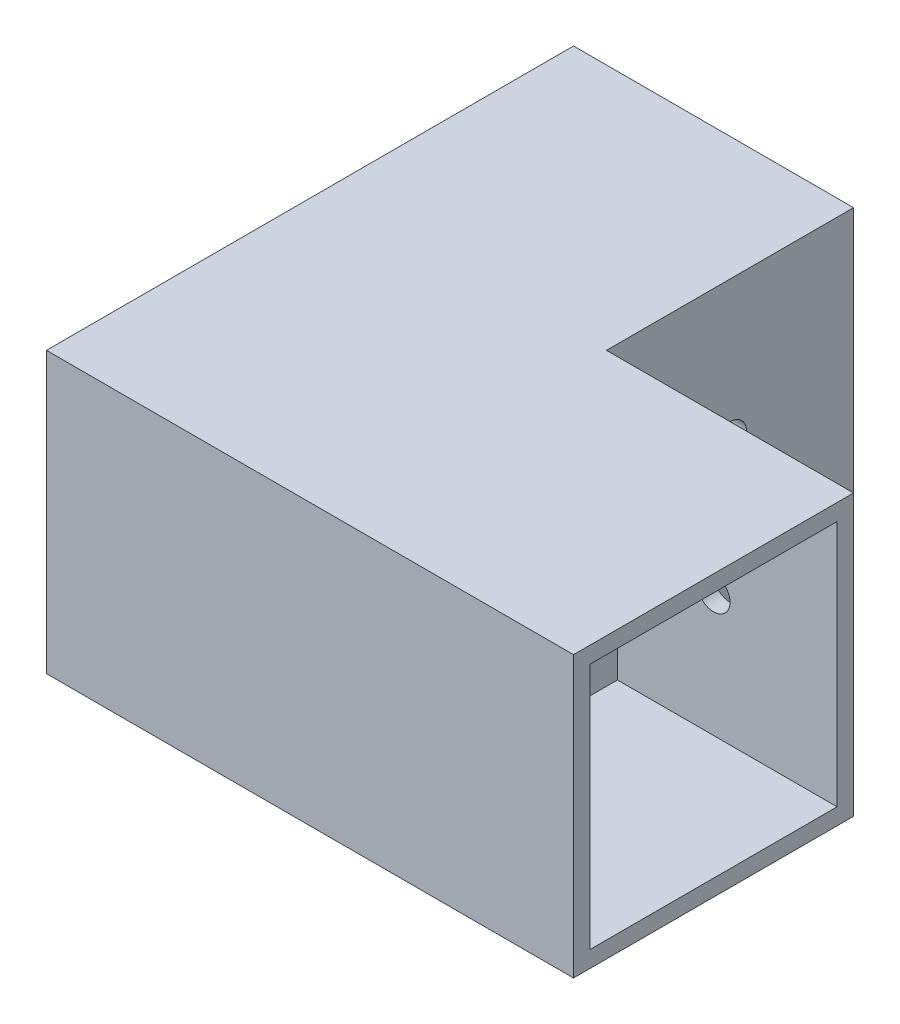
ISO-10303-21;
HEADER;
FILE_DESCRIPTION(('STEP AP214'),'2;1');
FILE_NAME('part.step','',(''),(''),'','','');
FILE_SCHEMA(('AUTOMOTIVE_DESIGN { 1 0 10303 214 1 1 1 1 }'));
ENDSEC;
DATA;
#1=APPLICATION_CONTEXT('core data for automotive mechanical design processes');
#2=APPLICATION_PROTOCOL_DEFINITION('international standard','automotive_design',2000,#1);
#3=PRODUCT_CONTEXT('',#1,'mechanical');
#4=PRODUCT('Part','Part','',(#3));
#5=PRODUCT_RELATED_PRODUCT_CATEGORY('part','',(#4));
#6=PRODUCT_DEFINITION_FORMATION('','',#4);
#7=PRODUCT_DEFINITION_CONTEXT('part definition',#1,'design');
#8=PRODUCT_DEFINITION('design','',#6,#7);
#9=PRODUCT_DEFINITION_SHAPE('','',#8);
#10=(LENGTH_UNIT() NAMED_UNIT(*) SI_UNIT(.MILLI.,.METRE.));
#11=(NAMED_UNIT(*) PLANE_ANGLE_UNIT() SI_UNIT($,.RADIAN.));
#12=(NAMED_UNIT(*) SI_UNIT($,.STERADIAN.) SOLID_ANGLE_UNIT());
#13=UNCERTAINTY_MEASURE_WITH_UNIT(LENGTH_MEASURE(1.E-05),#10,'distance_accuracy_value','');
#14=(GEOMETRIC_REPRESENTATION_CONTEXT(3) GLOBAL_UNCERTAINTY_ASSIGNED_CONTEXT((#13)) GLOBAL_UNIT_ASSIGNED_CONTEXT((#10,
#11,#12)) REPRESENTATION_CONTEXT('',''));
#15=CARTESIAN_POINT('',(0.,0.,0.));
#16=DIRECTION('',(0.,0.,1.));
#17=DIRECTION('',(1.,0.,0.));
#18=AXIS2_PLACEMENT_3D('',#15,#16,#17);
#19=CARTESIAN_POINT('',(93.,51.,3.));
#20=DIRECTION('',(0.,0.,-1.));
#21=DIRECTION('',(-1.,0.,0.));
#22=AXIS2_PLACEMENT_3D('',#19,#20,#21);
#23=PLANE('',#22);
#24=DIRECTION('',(1.,0.,0.));
#25=VECTOR('',#24,1.);
#26=CARTESIAN_POINT('',(93.,0.,3.));
#27=LINE('',#26,#25);
#28=CARTESIAN_POINT('',(-3.,0.,3.));
#29=VERTEX_POINT('',#28);
#30=CARTESIAN_POINT('',(93.,0.,3.));
#31=VERTEX_POINT('',#30);
#32=EDGE_CURVE('E199',#29,#31,#27,.T.);
#33=ORIENTED_EDGE('',*,*,#32,.T.);
#34=DIRECTION('',(0.,-1.,0.));
#35=VECTOR('',#34,1.);
#36=CARTESIAN_POINT('',(93.,51.,3.));
#37=LINE('',#36,#35);
#38=CARTESIAN_POINT('',(93.,51.,3.));
#39=VERTEX_POINT('',#38);
#40=EDGE_CURVE('E11',#39,#31,#37,.T.);
#41=ORIENTED_EDGE('',*,*,#40,.F.);
#42=DIRECTION('',(1.,0.,0.));
#43=VECTOR('',#42,1.);
#44=CARTESIAN_POINT('',(93.,51.,3.));
#45=LINE('',#44,#43);
#46=CARTESIAN_POINT('',(-3.,51.,3.));
#47=VERTEX_POINT('',#46);
#48=EDGE_CURVE('E205',#47,#39,#45,.T.);
#49=ORIENTED_EDGE('',*,*,#48,.F.);
#50=DIRECTION('',(0.,-1.,0.));
#51=VECTOR('',#50,1.);
#52=CARTESIAN_POINT('',(-3.,51.,3.));
#53=LINE('',#52,#51);
#54=EDGE_CURVE('E219',#47,#29,#53,.T.);
#55=ORIENTED_EDGE('',*,*,#54,.T.);
#56=EDGE_LOOP('',(#33,#41,#49,#55));
#57=FACE_BOUND('',#56,.T.);
#58=ADVANCED_FACE('F33',(#57),#23,.F.);
#59=CARTESIAN_POINT('',(93.,51.,-48.));
#60=DIRECTION('',(-1.,0.,0.));
#61=DIRECTION('',(0.,0.,1.));
#62=AXIS2_PLACEMENT_3D('',#59,#60,#61);
#63=PLANE('',#62);
#64=DIRECTION('',(0.,1.,0.));
#65=VECTOR('',#64,1.);
#66=CARTESIAN_POINT('',(93.,3.,-45.));
#67=LINE('',#66,#65);
#68=CARTESIAN_POINT('',(93.,3.,-45.));
#69=VERTEX_POINT('',#68);
#70=CARTESIAN_POINT('',(93.,48.,-45.));
#71=VERTEX_POINT('',#70);
#72=EDGE_CURVE('E189',#69,#71,#67,.T.);
#73=ORIENTED_EDGE('',*,*,#72,.F.);
#74=DIRECTION('',(0.,0.,-1.));
#75=VECTOR('',#74,1.);
#76=CARTESIAN_POINT('',(93.,3.,0.));
#77=LINE('',#76,#75);
#78=CARTESIAN_POINT('',(93.,3.,0.));
#79=VERTEX_POINT('',#78);
#80=EDGE_CURVE('E55',#79,#69,#77,.T.);
#81=ORIENTED_EDGE('',*,*,#80,.F.);
#82=DIRECTION('',(0.,-1.,0.));
#83=VECTOR('',#82,1.);
#84=CARTESIAN_POINT('',(93.,48.,0.));
#85=LINE('',#84,#83);
#86=CARTESIAN_POINT('',(93.,48.,0.));
#87=VERTEX_POINT('',#86);
#88=EDGE_CURVE('E178',#87,#79,#85,.T.);
#89=ORIENTED_EDGE('',*,*,#88,.F.);
#90=DIRECTION('',(0.,0.,1.));
#91=VECTOR('',#90,1.);
#92=CARTESIAN_POINT('',(93.,48.,-45.));
#93=LINE('',#92,#91);
#94=EDGE_CURVE('E192',#71,#87,#93,.T.);
#95=ORIENTED_EDGE('',*,*,#94,.F.);
#96=EDGE_LOOP('',(#73,#81,#89,#95));
#97=FACE_BOUND('',#96,.T.);
#98=DIRECTION('',(0.,0.,-1.));
#99=VECTOR('',#98,1.);
#100=CARTESIAN_POINT('',(93.,0.,-48.));
#101=LINE('',#100,#99);
#102=CARTESIAN_POINT('',(93.,0.,-48.));
#103=VERTEX_POINT('',#102);
#104=EDGE_CURVE('E222',#31,#103,#101,.T.);
#105=ORIENTED_EDGE('',*,*,#104,.T.);
#106=DIRECTION('',(0.,-1.,0.));
#107=VECTOR('',#106,1.);
#108=CARTESIAN_POINT('',(93.,51.,-48.));
#109=LINE('',#108,#107);
#110=CARTESIAN_POINT('',(93.,51.,-48.));
#111=VERTEX_POINT('',#110);
#112=EDGE_CURVE('E40',#111,#103,#109,.T.);
#113=ORIENTED_EDGE('',*,*,#112,.F.);
#114=DIRECTION('',(0.,0.,-1.));
#115=VECTOR('',#114,1.);
#116=CARTESIAN_POINT('',(93.,51.,-48.));
#117=LINE('',#116,#115);
#118=EDGE_CURVE('E208',#39,#111,#117,.T.);
#119=ORIENTED_EDGE('',*,*,#118,.F.);
#120=ORIENTED_EDGE('',*,*,#40,.T.);
#121=EDGE_LOOP('',(#105,#113,#119,#120));
#122=FACE_BOUND('',#121,.T.);
#123=ADVANCED_FACE('F269',(#97,#122),#63,.F.);
#124=CARTESIAN_POINT('',(48.,51.,-48.));
#125=DIRECTION('',(0.,0.,1.));
#126=DIRECTION('',(1.,0.,0.));
#127=AXIS2_PLACEMENT_3D('',#124,#125,#126);
#128=PLANE('',#127);
#129=CARTESIAN_POINT('',(70.5,25.5,-48.));
#130=DIRECTION('',(0.,0.,-1.));
#131=DIRECTION('',(-1.,0.,0.));
#132=AXIS2_PLACEMENT_3D('',#129,#130,#131);
#133=CIRCLE('',#132,3.00000000000001);
#134=CARTESIAN_POINT('',(67.5,25.5,-48.));
#135=VERTEX_POINT('',#134);
#136=EDGE_CURVE('E159',#135,#135,#133,.T.);
#137=ORIENTED_EDGE('',*,*,#136,.F.);
#138=EDGE_LOOP('',(#137));
#139=FACE_BOUND('',#138,.T.);
#140=DIRECTION('',(-1.,0.,0.));
#141=VECTOR('',#140,1.);
#142=CARTESIAN_POINT('',(48.,0.,-48.));
#143=LINE('',#142,#141);
#144=CARTESIAN_POINT('',(48.,0.,-48.));
#145=VERTEX_POINT('',#144);
#146=EDGE_CURVE('E224',#103,#145,#143,.T.);
#147=ORIENTED_EDGE('',*,*,#146,.T.);
#148=DIRECTION('',(0.,-1.,0.));
#149=VECTOR('',#148,1.);
#150=CARTESIAN_POINT('',(48.,51.,-48.));
#151=LINE('',#150,#149);
#152=CARTESIAN_POINT('',(48.,51.,-48.));
#153=VERTEX_POINT('',#152);
#154=EDGE_CURVE('E239',#153,#145,#151,.T.);
#155=ORIENTED_EDGE('',*,*,#154,.F.);
#156=DIRECTION('',(-1.,0.,0.));
#157=VECTOR('',#156,1.);
#158=CARTESIAN_POINT('',(48.,51.,-48.));
#159=LINE('',#158,#157);
#160=EDGE_CURVE('E211',#111,#153,#159,.T.);
#161=ORIENTED_EDGE('',*,*,#160,.F.);
#162=ORIENTED_EDGE('',*,*,#112,.T.);
#163=EDGE_LOOP('',(#147,#155,#161,#162));
#164=FACE_BOUND('',#163,.T.);
#165=ADVANCED_FACE('F246',(#139,#164),#128,.F.);
#166=CARTESIAN_POINT('',(48.,51.,-93.));
#167=DIRECTION('',(-1.,0.,0.));
#168=DIRECTION('',(0.,0.,1.));
#169=AXIS2_PLACEMENT_3D('',#166,#167,#168);
#170=PLANE('',#169);
#171=CARTESIAN_POINT('',(48.,25.5,-70.5));
#172=DIRECTION('',(1.,0.,0.));
#173=DIRECTION('',(0.,0.,-1.));
#174=AXIS2_PLACEMENT_3D('',#171,#172,#173);
#175=CIRCLE('',#174,3.00000000000001);
#176=CARTESIAN_POINT('',(48.,25.5,-73.5));
#177=VERTEX_POINT('',#176);
#178=EDGE_CURVE('E301',#177,#177,#175,.T.);
#179=ORIENTED_EDGE('',*,*,#178,.F.);
#180=EDGE_LOOP('',(#179));
#181=FACE_BOUND('',#180,.T.);
#182=DIRECTION('',(0.,0.,-1.));
#183=VECTOR('',#182,1.);
#184=CARTESIAN_POINT('',(48.,0.,-93.));
#185=LINE('',#184,#183);
#186=CARTESIAN_POINT('',(48.,0.,-93.));
#187=VERTEX_POINT('',#186);
#188=EDGE_CURVE('E226',#145,#187,#185,.T.);
#189=ORIENTED_EDGE('',*,*,#188,.T.);
#190=DIRECTION('',(0.,-1.,0.));
#191=VECTOR('',#190,1.);
#192=CARTESIAN_POINT('',(48.,51.,-93.));
#193=LINE('',#192,#191);
#194=CARTESIAN_POINT('',(48.,51.,-93.));
#195=VERTEX_POINT('',#194);
#196=EDGE_CURVE('E236',#195,#187,#193,.T.);
#197=ORIENTED_EDGE('',*,*,#196,.F.);
#198=DIRECTION('',(0.,0.,-1.));
#199=VECTOR('',#198,1.);
#200=CARTESIAN_POINT('',(48.,51.,-93.));
#201=LINE('',#200,#199);
#202=EDGE_CURVE('E213',#153,#195,#201,.T.);
#203=ORIENTED_EDGE('',*,*,#202,.F.);
#204=ORIENTED_EDGE('',*,*,#154,.T.);
#205=EDGE_LOOP('',(#189,#197,#203,#204));
#206=FACE_BOUND('',#205,.T.);
#207=ADVANCED_FACE('F257',(#181,#206),#170,.F.);
#208=CARTESIAN_POINT('',(-3.,51.,-93.));
#209=DIRECTION('',(0.,0.,1.));
#210=DIRECTION('',(1.,0.,0.));
#211=AXIS2_PLACEMENT_3D('',#208,#209,#210);
#212=PLANE('',#211);
#213=DIRECTION('',(0.,1.,0.));
#214=VECTOR('',#213,1.);
#215=CARTESIAN_POINT('',(0.,3.,-93.));
#216=LINE('',#215,#214);
#217=CARTESIAN_POINT('',(0.,3.,-93.));
#218=VERTEX_POINT('',#217);
#219=CARTESIAN_POINT('',(0.,48.,-93.));
#220=VERTEX_POINT('',#219);
#221=EDGE_CURVE('E165',#218,#220,#216,.T.);
#222=ORIENTED_EDGE('',*,*,#221,.F.);
#223=DIRECTION('',(-1.,0.,0.));
#224=VECTOR('',#223,1.);
#225=CARTESIAN_POINT('',(45.,3.,-93.));
#226=LINE('',#225,#224);
#227=CARTESIAN_POINT('',(45.,3.,-93.));
#228=VERTEX_POINT('',#227);
#229=EDGE_CURVE('E47',#228,#218,#226,.T.);
#230=ORIENTED_EDGE('',*,*,#229,.F.);
#231=DIRECTION('',(0.,-1.,0.));
#232=VECTOR('',#231,1.);
#233=CARTESIAN_POINT('',(45.,48.,-93.));
#234=LINE('',#233,#232);
#235=CARTESIAN_POINT('',(45.,48.,-93.));
#236=VERTEX_POINT('',#235);
#237=EDGE_CURVE('E153',#236,#228,#234,.T.);
#238=ORIENTED_EDGE('',*,*,#237,.F.);
#239=DIRECTION('',(1.,0.,0.));
#240=VECTOR('',#239,1.);
#241=CARTESIAN_POINT('',(0.,48.,-93.));
#242=LINE('',#241,#240);
#243=EDGE_CURVE('E156',#220,#236,#242,.T.);
#244=ORIENTED_EDGE('',*,*,#243,.F.);
#245=EDGE_LOOP('',(#222,#230,#238,#244));
#246=FACE_BOUND('',#245,.T.);
#247=DIRECTION('',(-1.,0.,0.));
#248=VECTOR('',#247,1.);
#249=CARTESIAN_POINT('',(-3.,0.,-93.));
#250=LINE('',#249,#248);
#251=CARTESIAN_POINT('',(-3.,0.,-93.));
#252=VERTEX_POINT('',#251);
#253=EDGE_CURVE('E228',#187,#252,#250,.T.);
#254=ORIENTED_EDGE('',*,*,#253,.T.);
#255=DIRECTION('',(0.,-1.,0.));
#256=VECTOR('',#255,1.);
#257=CARTESIAN_POINT('',(-3.,51.,-93.));
#258=LINE('',#257,#256);
#259=CARTESIAN_POINT('',(-3.,51.,-93.));
#260=VERTEX_POINT('',#259);
#261=EDGE_CURVE('E233',#260,#252,#258,.T.);
#262=ORIENTED_EDGE('',*,*,#261,.F.);
#263=DIRECTION('',(-1.,0.,0.));
#264=VECTOR('',#263,1.);
#265=CARTESIAN_POINT('',(-3.,51.,-93.));
#266=LINE('',#265,#264);
#267=EDGE_CURVE('E215',#195,#260,#266,.T.);
#268=ORIENTED_EDGE('',*,*,#267,.F.);
#269=ORIENTED_EDGE('',*,*,#196,.T.);
#270=EDGE_LOOP('',(#254,#262,#268,#269));
#271=FACE_BOUND('',#270,.T.);
#272=ADVANCED_FACE('F261',(#246,#271),#212,.F.);
#273=CARTESIAN_POINT('',(-3.,51.,3.));
#274=DIRECTION('',(1.,0.,0.));
#275=DIRECTION('',(0.,0.,-1.));
#276=AXIS2_PLACEMENT_3D('',#273,#274,#275);
#277=PLANE('',#276);
#278=DIRECTION('',(0.,0.,1.));
#279=VECTOR('',#278,1.);
#280=CARTESIAN_POINT('',(-3.,0.,3.));
#281=LINE('',#280,#279);
#282=EDGE_CURVE('E209',#252,#29,#281,.T.);
#283=ORIENTED_EDGE('',*,*,#282,.T.);
#284=ORIENTED_EDGE('',*,*,#54,.F.);
#285=DIRECTION('',(0.,0.,1.));
#286=VECTOR('',#285,1.);
#287=CARTESIAN_POINT('',(-3.,51.,3.));
#288=LINE('',#287,#286);
#289=EDGE_CURVE('E217',#260,#47,#288,.T.);
#290=ORIENTED_EDGE('',*,*,#289,.F.);
#291=ORIENTED_EDGE('',*,*,#261,.T.);
#292=EDGE_LOOP('',(#283,#284,#290,#291));
#293=FACE_BOUND('',#292,.T.);
#294=ADVANCED_FACE('F272',(#293),#277,.F.);
#295=CARTESIAN_POINT('',(0.,51.,0.));
#296=DIRECTION('',(0.,-1.,0.));
#297=DIRECTION('',(0.,0.,-1.));
#298=AXIS2_PLACEMENT_3D('',#295,#296,#297);
#299=PLANE('',#298);
#300=ORIENTED_EDGE('',*,*,#48,.T.);
#301=ORIENTED_EDGE('',*,*,#118,.T.);
#302=ORIENTED_EDGE('',*,*,#160,.T.);
#303=ORIENTED_EDGE('',*,*,#202,.T.);
#304=ORIENTED_EDGE('',*,*,#267,.T.);
#305=ORIENTED_EDGE('',*,*,#289,.T.);
#306=EDGE_LOOP('',(#300,#301,#302,#303,#304,#305));
#307=FACE_BOUND('',#306,.T.);
#308=ADVANCED_FACE('F265',(#307),#299,.F.);
#309=CARTESIAN_POINT('',(0.,0.,0.));
#310=DIRECTION('',(0.,-1.,0.));
#311=DIRECTION('',(0.,0.,-1.));
#312=AXIS2_PLACEMENT_3D('',#309,#310,#311);
#313=PLANE('',#312);
#314=ORIENTED_EDGE('',*,*,#32,.F.);
#315=ORIENTED_EDGE('',*,*,#282,.F.);
#316=ORIENTED_EDGE('',*,*,#253,.F.);
#317=ORIENTED_EDGE('',*,*,#188,.F.);
#318=ORIENTED_EDGE('',*,*,#146,.F.);
#319=ORIENTED_EDGE('',*,*,#104,.F.);
#320=EDGE_LOOP('',(#314,#315,#316,#317,#318,#319));
#321=FACE_BOUND('',#320,.T.);
#322=ADVANCED_FACE('F252',(#321),#313,.T.);
#323=CARTESIAN_POINT('',(53.,3.,0.));
#324=DIRECTION('',(0.,-1.,0.));
#325=DIRECTION('',(0.,0.,-1.));
#326=AXIS2_PLACEMENT_3D('',#323,#324,#325);
#327=PLANE('',#326);
#328=ORIENTED_EDGE('',*,*,#80,.T.);
#329=DIRECTION('',(1.,0.,0.));
#330=VECTOR('',#329,1.);
#331=CARTESIAN_POINT('',(53.,3.,-45.));
#332=LINE('',#331,#330);
#333=CARTESIAN_POINT('',(53.,3.,-45.));
#334=VERTEX_POINT('',#333);
#335=EDGE_CURVE('E187',#334,#69,#332,.T.);
#336=ORIENTED_EDGE('',*,*,#335,.F.);
#337=DIRECTION('',(0.,0.,-1.));
#338=VECTOR('',#337,1.);
#339=CARTESIAN_POINT('',(53.,3.,0.));
#340=LINE('',#339,#338);
#341=CARTESIAN_POINT('',(53.,3.,0.));
#342=VERTEX_POINT('',#341);
#343=EDGE_CURVE('E174',#342,#334,#340,.T.);
#344=ORIENTED_EDGE('',*,*,#343,.F.);
#345=DIRECTION('',(1.,0.,0.));
#346=VECTOR('',#345,1.);
#347=CARTESIAN_POINT('',(53.,3.,0.));
#348=LINE('',#347,#346);
#349=EDGE_CURVE('E197',#342,#79,#348,.T.);
#350=ORIENTED_EDGE('',*,*,#349,.T.);
#351=EDGE_LOOP('',(#328,#336,#344,#350));
#352=FACE_BOUND('',#351,.T.);
#353=ADVANCED_FACE('F346',(#352),#327,.F.);
#354=CARTESIAN_POINT('',(53.,48.,0.));
#355=DIRECTION('',(0.,0.,1.));
#356=DIRECTION('',(0.,-1.,0.));
#357=AXIS2_PLACEMENT_3D('',#354,#355,#356);
#358=PLANE('',#357);
#359=ORIENTED_EDGE('',*,*,#88,.T.);
#360=ORIENTED_EDGE('',*,*,#349,.F.);
#361=DIRECTION('',(0.,-1.,0.));
#362=VECTOR('',#361,1.);
#363=CARTESIAN_POINT('',(53.,48.,0.));
#364=LINE('',#363,#362);
#365=CARTESIAN_POINT('',(53.,48.,0.));
#366=VERTEX_POINT('',#365);
#367=EDGE_CURVE('E184',#366,#342,#364,.T.);
#368=ORIENTED_EDGE('',*,*,#367,.F.);
#369=DIRECTION('',(1.,0.,0.));
#370=VECTOR('',#369,1.);
#371=CARTESIAN_POINT('',(53.,48.,0.));
#372=LINE('',#371,#370);
#373=EDGE_CURVE('E200',#366,#87,#372,.T.);
#374=ORIENTED_EDGE('',*,*,#373,.T.);
#375=EDGE_LOOP('',(#359,#360,#368,#374));
#376=FACE_BOUND('',#375,.T.);
#377=ADVANCED_FACE('F342',(#376),#358,.F.);
#378=CARTESIAN_POINT('',(53.,48.,-45.));
#379=DIRECTION('',(0.,1.,0.));
#380=DIRECTION('',(0.,0.,1.));
#381=AXIS2_PLACEMENT_3D('',#378,#379,#380);
#382=PLANE('',#381);
#383=ORIENTED_EDGE('',*,*,#94,.T.);
#384=ORIENTED_EDGE('',*,*,#373,.F.);
#385=DIRECTION('',(0.,0.,1.));
#386=VECTOR('',#385,1.);
#387=CARTESIAN_POINT('',(53.,48.,-45.));
#388=LINE('',#387,#386);
#389=CARTESIAN_POINT('',(53.,48.,-45.));
#390=VERTEX_POINT('',#389);
#391=EDGE_CURVE('E181',#390,#366,#388,.T.);
#392=ORIENTED_EDGE('',*,*,#391,.F.);
#393=DIRECTION('',(1.,0.,0.));
#394=VECTOR('',#393,1.);
#395=CARTESIAN_POINT('',(53.,48.,-45.));
#396=LINE('',#395,#394);
#397=EDGE_CURVE('E202',#390,#71,#396,.T.);
#398=ORIENTED_EDGE('',*,*,#397,.T.);
#399=EDGE_LOOP('',(#383,#384,#392,#398));
#400=FACE_BOUND('',#399,.T.);
#401=ADVANCED_FACE('F345',(#400),#382,.F.);
#402=CARTESIAN_POINT('',(53.,3.,-45.));
#403=DIRECTION('',(0.,0.,-1.));
#404=DIRECTION('',(-1.,0.,0.));
#405=AXIS2_PLACEMENT_3D('',#402,#403,#404);
#406=PLANE('',#405);
#407=CARTESIAN_POINT('',(70.5,25.5,-45.));
#408=DIRECTION('',(0.,0.,-1.));
#409=DIRECTION('',(-1.,0.,0.));
#410=AXIS2_PLACEMENT_3D('',#407,#408,#409);
#411=CIRCLE('',#410,3.00000000000001);
#412=CARTESIAN_POINT('',(67.5,25.5,-45.));
#413=VERTEX_POINT('',#412);
#414=EDGE_CURVE('E306',#413,#413,#411,.F.);
#415=ORIENTED_EDGE('',*,*,#414,.F.);
#416=EDGE_LOOP('',(#415));
#417=FACE_BOUND('',#416,.T.);
#418=ORIENTED_EDGE('',*,*,#72,.T.);
#419=ORIENTED_EDGE('',*,*,#397,.F.);
#420=DIRECTION('',(0.,1.,0.));
#421=VECTOR('',#420,1.);
#422=CARTESIAN_POINT('',(53.,3.,-45.));
#423=LINE('',#422,#421);
#424=EDGE_CURVE('E177',#334,#390,#423,.T.);
#425=ORIENTED_EDGE('',*,*,#424,.F.);
#426=ORIENTED_EDGE('',*,*,#335,.T.);
#427=EDGE_LOOP('',(#418,#419,#425,#426));
#428=FACE_BOUND('',#427,.T.);
#429=ADVANCED_FACE('F340',(#417,#428),#406,.F.);
#430=CARTESIAN_POINT('',(53.,0.,0.));
#431=DIRECTION('',(1.,0.,0.));
#432=DIRECTION('',(0.,0.,-1.));
#433=AXIS2_PLACEMENT_3D('',#430,#431,#432);
#434=PLANE('',#433);
#435=ORIENTED_EDGE('',*,*,#343,.T.);
#436=ORIENTED_EDGE('',*,*,#424,.T.);
#437=ORIENTED_EDGE('',*,*,#391,.T.);
#438=ORIENTED_EDGE('',*,*,#367,.T.);
#439=EDGE_LOOP('',(#435,#436,#437,#438));
#440=FACE_BOUND('',#439,.T.);
#441=ADVANCED_FACE('F337',(#440),#434,.T.);
#442=CARTESIAN_POINT('',(45.,3.,-53.));
#443=DIRECTION('',(0.,-1.,0.));
#444=DIRECTION('',(0.,0.,-1.));
#445=AXIS2_PLACEMENT_3D('',#442,#443,#444);
#446=PLANE('',#445);
#447=ORIENTED_EDGE('',*,*,#229,.T.);
#448=DIRECTION('',(0.,0.,-1.));
#449=VECTOR('',#448,1.);
#450=CARTESIAN_POINT('',(0.,3.,-53.));
#451=LINE('',#450,#449);
#452=CARTESIAN_POINT('',(0.,3.,-53.));
#453=VERTEX_POINT('',#452);
#454=EDGE_CURVE('E131',#453,#218,#451,.T.);
#455=ORIENTED_EDGE('',*,*,#454,.F.);
#456=DIRECTION('',(-1.,0.,0.));
#457=VECTOR('',#456,1.);
#458=CARTESIAN_POINT('',(45.,3.,-53.));
#459=LINE('',#458,#457);
#460=CARTESIAN_POINT('',(45.,3.,-53.));
#461=VERTEX_POINT('',#460);
#462=EDGE_CURVE('E135',#461,#453,#459,.T.);
#463=ORIENTED_EDGE('',*,*,#462,.F.);
#464=DIRECTION('',(0.,0.,-1.));
#465=VECTOR('',#464,1.);
#466=CARTESIAN_POINT('',(45.,3.,-53.));
#467=LINE('',#466,#465);
#468=EDGE_CURVE('E169',#461,#228,#467,.T.);
#469=ORIENTED_EDGE('',*,*,#468,.T.);
#470=EDGE_LOOP('',(#447,#455,#463,#469));
#471=FACE_BOUND('',#470,.T.);
#472=ADVANCED_FACE('F133',(#471),#446,.F.);
#473=CARTESIAN_POINT('',(45.,48.,-53.));
#474=DIRECTION('',(1.,0.,0.));
#475=DIRECTION('',(0.,0.,-1.));
#476=AXIS2_PLACEMENT_3D('',#473,#474,#475);
#477=PLANE('',#476);
#478=CARTESIAN_POINT('',(45.,25.5,-70.5));
#479=DIRECTION('',(1.,0.,0.));
#480=DIRECTION('',(0.,0.,-1.));
#481=AXIS2_PLACEMENT_3D('',#478,#479,#480);
#482=CIRCLE('',#481,3.00000000000001);
#483=CARTESIAN_POINT('',(45.,25.5,-73.5));
#484=VERTEX_POINT('',#483);
#485=EDGE_CURVE('E303',#484,#484,#482,.F.);
#486=ORIENTED_EDGE('',*,*,#485,.F.);
#487=EDGE_LOOP('',(#486));
#488=FACE_BOUND('',#487,.T.);
#489=ORIENTED_EDGE('',*,*,#237,.T.);
#490=ORIENTED_EDGE('',*,*,#468,.F.);
#491=DIRECTION('',(0.,-1.,0.));
#492=VECTOR('',#491,1.);
#493=CARTESIAN_POINT('',(45.,48.,-53.));
#494=LINE('',#493,#492);
#495=CARTESIAN_POINT('',(45.,48.,-53.));
#496=VERTEX_POINT('',#495);
#497=EDGE_CURVE('E141',#496,#461,#494,.T.);
#498=ORIENTED_EDGE('',*,*,#497,.F.);
#499=DIRECTION('',(0.,0.,-1.));
#500=VECTOR('',#499,1.);
#501=CARTESIAN_POINT('',(45.,48.,-53.));
#502=LINE('',#501,#500);
#503=EDGE_CURVE('E171',#496,#236,#502,.T.);
#504=ORIENTED_EDGE('',*,*,#503,.T.);
#505=EDGE_LOOP('',(#489,#490,#498,#504));
#506=FACE_BOUND('',#505,.T.);
#507=ADVANCED_FACE('F325',(#488,#506),#477,.F.);
#508=CARTESIAN_POINT('',(0.,48.,-53.));
#509=DIRECTION('',(0.,1.,0.));
#510=DIRECTION('',(0.,0.,1.));
#511=AXIS2_PLACEMENT_3D('',#508,#509,#510);
#512=PLANE('',#511);
#513=ORIENTED_EDGE('',*,*,#243,.T.);
#514=ORIENTED_EDGE('',*,*,#503,.F.);
#515=DIRECTION('',(1.,0.,0.));
#516=VECTOR('',#515,1.);
#517=CARTESIAN_POINT('',(0.,48.,-53.));
#518=LINE('',#517,#516);
#519=CARTESIAN_POINT('',(0.,48.,-53.));
#520=VERTEX_POINT('',#519);
#521=EDGE_CURVE('E149',#520,#496,#518,.T.);
#522=ORIENTED_EDGE('',*,*,#521,.F.);
#523=DIRECTION('',(0.,0.,-1.));
#524=VECTOR('',#523,1.);
#525=CARTESIAN_POINT('',(0.,48.,-53.));
#526=LINE('',#525,#524);
#527=EDGE_CURVE('E140',#520,#220,#526,.T.);
#528=ORIENTED_EDGE('',*,*,#527,.T.);
#529=EDGE_LOOP('',(#513,#514,#522,#528));
#530=FACE_BOUND('',#529,.T.);
#531=ADVANCED_FACE('F328',(#530),#512,.F.);
#532=CARTESIAN_POINT('',(0.,3.,-53.));
#533=DIRECTION('',(-1.,0.,0.));
#534=DIRECTION('',(0.,0.,1.));
#535=AXIS2_PLACEMENT_3D('',#532,#533,#534);
#536=PLANE('',#535);
#537=ORIENTED_EDGE('',*,*,#221,.T.);
#538=ORIENTED_EDGE('',*,*,#527,.F.);
#539=DIRECTION('',(0.,1.,0.));
#540=VECTOR('',#539,1.);
#541=CARTESIAN_POINT('',(0.,3.,-53.));
#542=LINE('',#541,#540);
#543=EDGE_CURVE('E144',#453,#520,#542,.T.);
#544=ORIENTED_EDGE('',*,*,#543,.F.);
#545=ORIENTED_EDGE('',*,*,#454,.T.);
#546=EDGE_LOOP('',(#537,#538,#544,#545));
#547=FACE_BOUND('',#546,.T.);
#548=ADVANCED_FACE('F145',(#547),#536,.F.);
#549=CARTESIAN_POINT('',(0.,0.,-53.));
#550=DIRECTION('',(0.,0.,-1.));
#551=DIRECTION('',(-1.,0.,0.));
#552=AXIS2_PLACEMENT_3D('',#549,#550,#551);
#553=PLANE('',#552);
#554=ORIENTED_EDGE('',*,*,#462,.T.);
#555=ORIENTED_EDGE('',*,*,#543,.T.);
#556=ORIENTED_EDGE('',*,*,#521,.T.);
#557=ORIENTED_EDGE('',*,*,#497,.T.);
#558=EDGE_LOOP('',(#554,#555,#556,#557));
#559=FACE_BOUND('',#558,.T.);
#560=ADVANCED_FACE('F151',(#559),#553,.T.);
#561=CARTESIAN_POINT('',(70.5,25.5,3.001));
#562=DIRECTION('',(0.,0.,-1.));
#563=DIRECTION('',(-1.,0.,0.));
#564=AXIS2_PLACEMENT_3D('',#561,#562,#563);
#565=CYLINDRICAL_SURFACE('',#564,3.00000000000001);
#566=CARTESIAN_POINT('',(67.5,25.5,-48.));
#567=CARTESIAN_POINT('',(67.5,25.5,-47.96875));
#568=CARTESIAN_POINT('',(67.5,25.5,-47.9375));
#569=CARTESIAN_POINT('',(67.5,25.5,-47.875));
#570=CARTESIAN_POINT('',(67.5,25.5,-47.84375));
#571=CARTESIAN_POINT('',(67.5,25.5,-47.78125));
#572=CARTESIAN_POINT('',(67.5,25.5,-47.75));
#573=CARTESIAN_POINT('',(67.5,25.5,-47.6875));
#574=CARTESIAN_POINT('',(67.5,25.5,-47.65625));
#575=CARTESIAN_POINT('',(67.5,25.5,-47.59375));
#576=CARTESIAN_POINT('',(67.5,25.5,-47.5625));
#577=CARTESIAN_POINT('',(67.5,25.5,-47.5));
#578=CARTESIAN_POINT('',(67.5,25.5,-47.46875));
#579=CARTESIAN_POINT('',(67.5,25.5,-47.40625));
#580=CARTESIAN_POINT('',(67.5,25.5,-47.375));
#581=CARTESIAN_POINT('',(67.5,25.5,-47.3125));
#582=CARTESIAN_POINT('',(67.5,25.5,-47.28125));
#583=CARTESIAN_POINT('',(67.5,25.5,-47.21875));
#584=CARTESIAN_POINT('',(67.5,25.5,-47.1875));
#585=CARTESIAN_POINT('',(67.5,25.5,-47.125));
#586=CARTESIAN_POINT('',(67.5,25.5,-47.09375));
#587=CARTESIAN_POINT('',(67.5,25.5,-47.03125));
#588=CARTESIAN_POINT('',(67.5,25.5,-47.));
#589=CARTESIAN_POINT('',(67.5,25.5,-46.9375));
#590=CARTESIAN_POINT('',(67.5,25.5,-46.90625));
#591=CARTESIAN_POINT('',(67.5,25.5,-46.84375));
#592=CARTESIAN_POINT('',(67.5,25.5,-46.8125));
#593=CARTESIAN_POINT('',(67.5,25.5,-46.75));
#594=CARTESIAN_POINT('',(67.5,25.5,-46.71875));
#595=CARTESIAN_POINT('',(67.5,25.5,-46.65625));
#596=CARTESIAN_POINT('',(67.5,25.5,-46.625));
#597=CARTESIAN_POINT('',(67.5,25.5,-46.5625));
#598=CARTESIAN_POINT('',(67.5,25.5,-46.53125));
#599=CARTESIAN_POINT('',(67.5,25.5,-46.46875));
#600=CARTESIAN_POINT('',(67.5,25.5,-46.4375));
#601=CARTESIAN_POINT('',(67.5,25.5,-46.375));
#602=CARTESIAN_POINT('',(67.5,25.5,-46.34375));
#603=CARTESIAN_POINT('',(67.5,25.5,-46.28125));
#604=CARTESIAN_POINT('',(67.5,25.5,-46.25));
#605=CARTESIAN_POINT('',(67.5,25.5,-46.1875));
#606=CARTESIAN_POINT('',(67.5,25.5,-46.15625));
#607=CARTESIAN_POINT('',(67.5,25.5,-46.09375));
#608=CARTESIAN_POINT('',(67.5,25.5,-46.0625));
#609=CARTESIAN_POINT('',(67.5,25.5,-46.));
#610=CARTESIAN_POINT('',(67.5,25.5,-45.96875));
#611=CARTESIAN_POINT('',(67.5,25.5,-45.90625));
#612=CARTESIAN_POINT('',(67.5,25.5,-45.875));
#613=CARTESIAN_POINT('',(67.5,25.5,-45.8125));
#614=CARTESIAN_POINT('',(67.5,25.5,-45.78125));
#615=CARTESIAN_POINT('',(67.5,25.5,-45.71875));
#616=CARTESIAN_POINT('',(67.5,25.5,-45.6875));
#617=CARTESIAN_POINT('',(67.5,25.5,-45.625));
#618=CARTESIAN_POINT('',(67.5,25.5,-45.59375));
#619=CARTESIAN_POINT('',(67.5,25.5,-45.53125));
#620=CARTESIAN_POINT('',(67.5,25.5,-45.5));
#621=CARTESIAN_POINT('',(67.5,25.5,-45.4375));
#622=CARTESIAN_POINT('',(67.5,25.5,-45.40625));
#623=CARTESIAN_POINT('',(67.5,25.5,-45.34375));
#624=CARTESIAN_POINT('',(67.5,25.5,-45.3125));
#625=CARTESIAN_POINT('',(67.5,25.5,-45.25));
#626=CARTESIAN_POINT('',(67.5,25.5,-45.21875));
#627=CARTESIAN_POINT('',(67.5,25.5,-45.15625));
#628=CARTESIAN_POINT('',(67.5,25.5,-45.125));
#629=CARTESIAN_POINT('',(67.5,25.5,-45.0625));
#630=CARTESIAN_POINT('',(67.5,25.5,-45.03125));
#631=CARTESIAN_POINT('',(67.5,25.5,-45.));
#632=B_SPLINE_CURVE_WITH_KNOTS('',3,(#566,#567,#568,#569,#570,#571,#572,#573,#574,#575,#576,
#577,#578,#579,#580,#581,#582,#583,#584,#585,#586,#587,#588,#589,#590,#591,#592,#593,#594,#595,
#596,#597,#598,#599,#600,#601,#602,#603,#604,#605,#606,#607,#608,#609,#610,#611,#612,#613,#614,
#615,#616,#617,#618,#619,#620,#621,#622,#623,#624,#625,#626,#627,#628,#629,#630,#631),
.UNSPECIFIED.,.F.,.F.,(4,2,2,2,2,2,2,2,2,2,2,2,2,2,2,2,2,2,2,2,2,2,2,2,2,2,2,2,2,2,2,2,4),(0.,
0.0937500000000036,0.1875,0.281249999999997,0.375,0.468750000000004,0.5625,0.656249999999997,
0.750000000000001,0.843750000000004,0.937500000000001,1.03125,1.125,1.21875,1.3125,1.40625,1.5,
1.59375,1.6875,1.78125,1.875,1.96875000000001,2.0625,2.15625,2.25,2.34375000000001,2.4375,
2.53125,2.625,2.71875000000001,2.8125,2.90625,3.),.UNSPECIFIED.);
#633=EDGE_CURVE('BSEAM314',#135,#413,#632,.T.);
#634=ORIENTED_EDGE('',*,*,#136,.T.);
#635=ORIENTED_EDGE('',*,*,#414,.T.);
#636=ORIENTED_EDGE('',*,*,#633,.T.);
#637=ORIENTED_EDGE('',*,*,#633,.F.);
#638=EDGE_LOOP('',(#634,#636,#635,#637));
#639=FACE_BOUND('',#638,.T.);
#640=ADVANCED_FACE('F314',(#639),#565,.F.);
#641=CARTESIAN_POINT('',(-3.00100000000002,25.5,-70.5));
#642=DIRECTION('',(1.,0.,0.));
#643=DIRECTION('',(0.,0.,-1.));
#644=AXIS2_PLACEMENT_3D('',#641,#642,#643);
#645=CYLINDRICAL_SURFACE('',#644,3.00000000000001);
#646=ORIENTED_EDGE('',*,*,#178,.T.);
#647=EDGE_LOOP('',(#646));
#648=FACE_BOUND('',#647,.T.);
#649=ORIENTED_EDGE('',*,*,#485,.T.);
#650=EDGE_LOOP('',(#649));
#651=FACE_BOUND('',#650,.T.);
#652=ADVANCED_FACE('F316',(#648,#651),#645,.F.);
#653=CLOSED_SHELL('',(#58,#123,#165,#207,#272,#294,#308,#322,#353,#377,#401,#429,#441,#472,#507,
#531,#548,#560,#640,#652));
#654=MANIFOLD_SOLID_BREP('B2',#653);
#655=ADVANCED_BREP_SHAPE_REPRESENTATION('',(#18,#654),#14);
#656=SHAPE_DEFINITION_REPRESENTATION(#9,#655);
ENDSEC;
END-ISO-10303-21;
